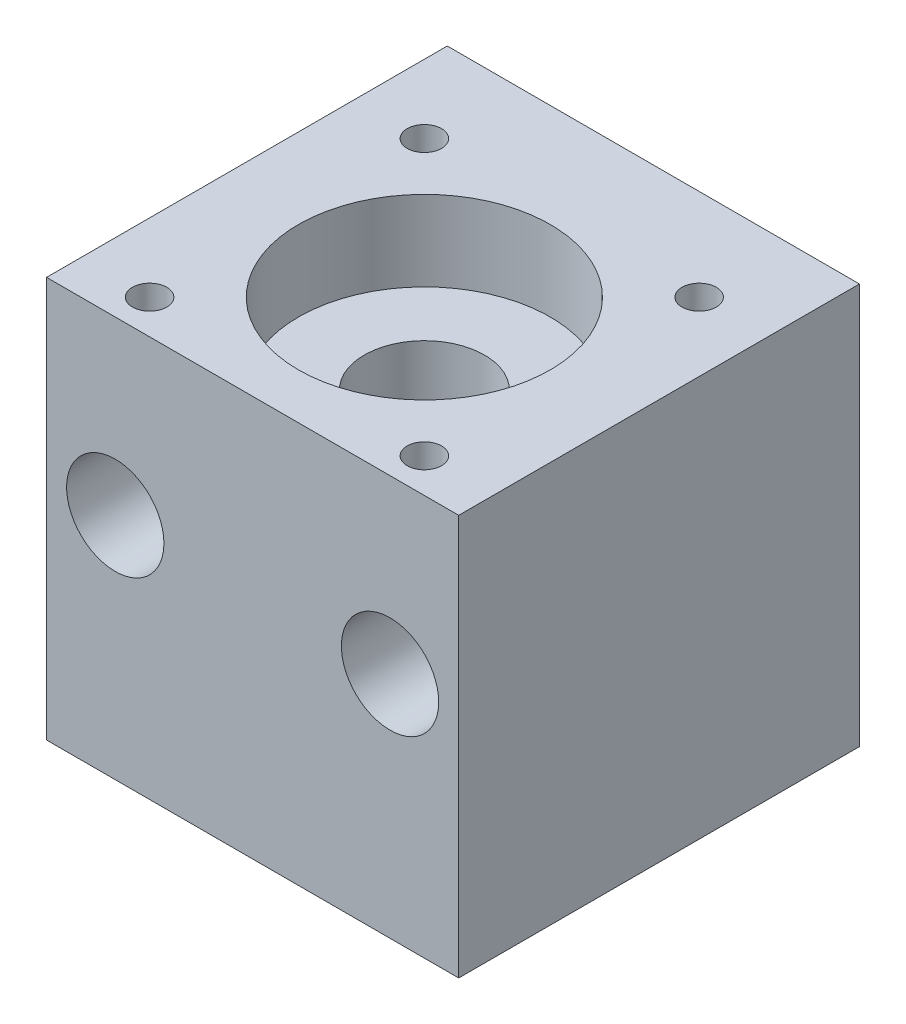
ISO-10303-21;
HEADER;
FILE_DESCRIPTION(('STEP AP214'),'2;1');
FILE_NAME('part.step','',(''),(''),'','','');
FILE_SCHEMA(('AUTOMOTIVE_DESIGN { 1 0 10303 214 1 1 1 1 }'));
ENDSEC;
DATA;
#1=APPLICATION_CONTEXT('core data for automotive mechanical design processes');
#2=APPLICATION_PROTOCOL_DEFINITION('international standard','automotive_design',2000,#1);
#3=PRODUCT_CONTEXT('',#1,'mechanical');
#4=PRODUCT('Part','Part','',(#3));
#5=PRODUCT_RELATED_PRODUCT_CATEGORY('part','',(#4));
#6=PRODUCT_DEFINITION_FORMATION('','',#4);
#7=PRODUCT_DEFINITION_CONTEXT('part definition',#1,'design');
#8=PRODUCT_DEFINITION('design','',#6,#7);
#9=PRODUCT_DEFINITION_SHAPE('','',#8);
#10=(LENGTH_UNIT() NAMED_UNIT(*) SI_UNIT(.MILLI.,.METRE.));
#11=(NAMED_UNIT(*) PLANE_ANGLE_UNIT() SI_UNIT($,.RADIAN.));
#12=(NAMED_UNIT(*) SI_UNIT($,.STERADIAN.) SOLID_ANGLE_UNIT());
#13=UNCERTAINTY_MEASURE_WITH_UNIT(LENGTH_MEASURE(1.E-05),#10,'distance_accuracy_value','');
#14=(GEOMETRIC_REPRESENTATION_CONTEXT(3) GLOBAL_UNCERTAINTY_ASSIGNED_CONTEXT((#13)) GLOBAL_UNIT_ASSIGNED_CONTEXT((#10,
#11,#12)) REPRESENTATION_CONTEXT('',''));
#15=CARTESIAN_POINT('',(0.,0.,0.));
#16=DIRECTION('',(0.,0.,1.));
#17=DIRECTION('',(1.,0.,0.));
#18=AXIS2_PLACEMENT_3D('',#15,#16,#17);
#19=CARTESIAN_POINT('',(18.,0.0077,20.0019));
#20=DIRECTION('',(0.,1.,0.));
#21=DIRECTION('',(0.,0.,1.));
#22=AXIS2_PLACEMENT_3D('',#19,#20,#21);
#23=CYLINDRICAL_SURFACE('',#22,5.25);
#24=CARTESIAN_POINT('',(18.,28.0077,20.0019));
#25=DIRECTION('',(0.,1.,0.));
#26=DIRECTION('',(0.,0.,1.));
#27=AXIS2_PLACEMENT_3D('',#24,#25,#26);
#28=CIRCLE('',#27,5.25);
#29=CARTESIAN_POINT('',(18.,28.0077,25.2519));
#30=VERTEX_POINT('',#29);
#31=EDGE_CURVE('E163',#30,#30,#28,.F.);
#32=ORIENTED_EDGE('',*,*,#31,.F.);
#33=EDGE_LOOP('',(#32));
#34=FACE_BOUND('',#33,.T.);
#35=CARTESIAN_POINT('',(18.,7.0077,20.0019));
#36=DIRECTION('',(0.,1.,0.));
#37=DIRECTION('',(0.,0.,1.));
#38=AXIS2_PLACEMENT_3D('',#35,#36,#37);
#39=CIRCLE('',#38,5.25);
#40=CARTESIAN_POINT('',(18.,7.0077,25.2519));
#41=VERTEX_POINT('',#40);
#42=EDGE_CURVE('E18',#41,#41,#39,.F.);
#43=ORIENTED_EDGE('',*,*,#42,.T.);
#44=EDGE_LOOP('',(#43));
#45=FACE_BOUND('',#44,.T.);
#46=ADVANCED_FACE('F15',(#34,#45),#23,.F.);
#47=CARTESIAN_POINT('',(6.,8.0077,8.0019));
#48=DIRECTION('',(0.,1.,0.));
#49=DIRECTION('',(0.,0.,1.));
#50=AXIS2_PLACEMENT_3D('',#47,#48,#49);
#51=PLANE('',#50);
#52=CARTESIAN_POINT('',(6.,8.0077,8.0019));
#53=DIRECTION('',(0.,1.,0.));
#54=DIRECTION('',(0.,0.,1.));
#55=AXIS2_PLACEMENT_3D('',#52,#53,#54);
#56=CIRCLE('',#55,1.5);
#57=CARTESIAN_POINT('',(6.,8.0077,9.5019));
#58=VERTEX_POINT('',#57);
#59=EDGE_CURVE('E161',#58,#58,#56,.F.);
#60=ORIENTED_EDGE('',*,*,#59,.T.);
#61=EDGE_LOOP('',(#60));
#62=FACE_BOUND('',#61,.T.);
#63=ADVANCED_FACE('F314',(#62),#51,.F.);
#64=CARTESIAN_POINT('',(6.,8.0077,32.0019));
#65=DIRECTION('',(0.,1.,0.));
#66=DIRECTION('',(0.,0.,1.));
#67=AXIS2_PLACEMENT_3D('',#64,#65,#66);
#68=PLANE('',#67);
#69=CARTESIAN_POINT('',(6.,8.0077,32.0019));
#70=DIRECTION('',(0.,1.,0.));
#71=DIRECTION('',(0.,0.,1.));
#72=AXIS2_PLACEMENT_3D('',#69,#70,#71);
#73=CIRCLE('',#72,1.5);
#74=CARTESIAN_POINT('',(6.,8.0077,33.5019));
#75=VERTEX_POINT('',#74);
#76=EDGE_CURVE('E158',#75,#75,#73,.F.);
#77=ORIENTED_EDGE('',*,*,#76,.T.);
#78=EDGE_LOOP('',(#77));
#79=FACE_BOUND('',#78,.T.);
#80=ADVANCED_FACE('F311',(#79),#68,.F.);
#81=CARTESIAN_POINT('',(30.,8.0077,8.0019));
#82=DIRECTION('',(0.,1.,0.));
#83=DIRECTION('',(0.,0.,1.));
#84=AXIS2_PLACEMENT_3D('',#81,#82,#83);
#85=PLANE('',#84);
#86=CARTESIAN_POINT('',(30.,8.0077,8.0019));
#87=DIRECTION('',(0.,1.,0.));
#88=DIRECTION('',(0.,0.,1.));
#89=AXIS2_PLACEMENT_3D('',#86,#87,#88);
#90=CIRCLE('',#89,1.5);
#91=CARTESIAN_POINT('',(30.,8.0077,9.5019));
#92=VERTEX_POINT('',#91);
#93=EDGE_CURVE('E155',#92,#92,#90,.F.);
#94=ORIENTED_EDGE('',*,*,#93,.T.);
#95=EDGE_LOOP('',(#94));
#96=FACE_BOUND('',#95,.T.);
#97=ADVANCED_FACE('F175',(#96),#85,.F.);
#98=CARTESIAN_POINT('',(18.,7.0077,20.0019));
#99=DIRECTION('',(0.,1.,0.));
#100=DIRECTION('',(0.,0.,1.));
#101=AXIS2_PLACEMENT_3D('',#98,#99,#100);
#102=PLANE('',#101);
#103=ORIENTED_EDGE('',*,*,#42,.F.);
#104=EDGE_LOOP('',(#103));
#105=FACE_BOUND('',#104,.T.);
#106=CARTESIAN_POINT('',(18.,7.0077,20.0019));
#107=DIRECTION('',(0.,1.,0.));
#108=DIRECTION('',(0.,0.,1.));
#109=AXIS2_PLACEMENT_3D('',#106,#107,#108);
#110=CIRCLE('',#109,11.);
#111=CARTESIAN_POINT('',(18.,7.0077,31.0019));
#112=VERTEX_POINT('',#111);
#113=EDGE_CURVE('E152',#112,#112,#110,.F.);
#114=ORIENTED_EDGE('',*,*,#113,.T.);
#115=EDGE_LOOP('',(#114));
#116=FACE_BOUND('',#115,.T.);
#117=ADVANCED_FACE('F171',(#105,#116),#102,.F.);
#118=CARTESIAN_POINT('',(30.,8.0077,32.0019));
#119=DIRECTION('',(0.,1.,0.));
#120=DIRECTION('',(0.,0.,1.));
#121=AXIS2_PLACEMENT_3D('',#118,#119,#120);
#122=PLANE('',#121);
#123=CARTESIAN_POINT('',(30.,8.0077,32.0019));
#124=DIRECTION('',(0.,1.,0.));
#125=DIRECTION('',(0.,0.,1.));
#126=AXIS2_PLACEMENT_3D('',#123,#124,#125);
#127=CIRCLE('',#126,1.5);
#128=CARTESIAN_POINT('',(30.,8.0077,33.5019));
#129=VERTEX_POINT('',#128);
#130=EDGE_CURVE('E149',#129,#129,#127,.F.);
#131=ORIENTED_EDGE('',*,*,#130,.T.);
#132=EDGE_LOOP('',(#131));
#133=FACE_BOUND('',#132,.T.);
#134=ADVANCED_FACE('F174',(#133),#122,.F.);
#135=CARTESIAN_POINT('',(6.,27.0077,8.0019));
#136=DIRECTION('',(0.,-1.,0.));
#137=DIRECTION('',(0.,0.,-1.));
#138=AXIS2_PLACEMENT_3D('',#135,#136,#137);
#139=PLANE('',#138);
#140=CARTESIAN_POINT('',(6.,27.0077,8.0019));
#141=DIRECTION('',(0.,-1.,0.));
#142=DIRECTION('',(0.,0.,-1.));
#143=AXIS2_PLACEMENT_3D('',#140,#141,#142);
#144=CIRCLE('',#143,1.5);
#145=CARTESIAN_POINT('',(6.,27.0077,6.5019));
#146=VERTEX_POINT('',#145);
#147=EDGE_CURVE('E140',#146,#146,#144,.F.);
#148=ORIENTED_EDGE('',*,*,#147,.T.);
#149=EDGE_LOOP('',(#148));
#150=FACE_BOUND('',#149,.T.);
#151=ADVANCED_FACE('F301',(#150),#139,.F.);
#152=CARTESIAN_POINT('',(6.,27.0077,32.0019));
#153=DIRECTION('',(0.,-1.,0.));
#154=DIRECTION('',(0.,0.,-1.));
#155=AXIS2_PLACEMENT_3D('',#152,#153,#154);
#156=PLANE('',#155);
#157=CARTESIAN_POINT('',(6.,27.0077,32.0019));
#158=DIRECTION('',(0.,-1.,0.));
#159=DIRECTION('',(0.,0.,-1.));
#160=AXIS2_PLACEMENT_3D('',#157,#158,#159);
#161=CIRCLE('',#160,1.5);
#162=CARTESIAN_POINT('',(6.,27.0077,30.5019));
#163=VERTEX_POINT('',#162);
#164=EDGE_CURVE('E137',#163,#163,#161,.F.);
#165=ORIENTED_EDGE('',*,*,#164,.T.);
#166=EDGE_LOOP('',(#165));
#167=FACE_BOUND('',#166,.T.);
#168=ADVANCED_FACE('F297',(#167),#156,.F.);
#169=CARTESIAN_POINT('',(30.,27.0077,8.0019));
#170=DIRECTION('',(0.,-1.,0.));
#171=DIRECTION('',(0.,0.,-1.));
#172=AXIS2_PLACEMENT_3D('',#169,#170,#171);
#173=PLANE('',#172);
#174=CARTESIAN_POINT('',(30.,27.0077,8.0019));
#175=DIRECTION('',(0.,-1.,0.));
#176=DIRECTION('',(0.,0.,-1.));
#177=AXIS2_PLACEMENT_3D('',#174,#175,#176);
#178=CIRCLE('',#177,1.5);
#179=CARTESIAN_POINT('',(30.,27.0077,6.5019));
#180=VERTEX_POINT('',#179);
#181=EDGE_CURVE('E134',#180,#180,#178,.F.);
#182=ORIENTED_EDGE('',*,*,#181,.T.);
#183=EDGE_LOOP('',(#182));
#184=FACE_BOUND('',#183,.T.);
#185=ADVANCED_FACE('F294',(#184),#173,.F.);
#186=CARTESIAN_POINT('',(18.,28.0077,20.0019));
#187=DIRECTION('',(0.,1.,0.));
#188=DIRECTION('',(0.,0.,1.));
#189=AXIS2_PLACEMENT_3D('',#186,#187,#188);
#190=PLANE('',#189);
#191=ORIENTED_EDGE('',*,*,#31,.T.);
#192=EDGE_LOOP('',(#191));
#193=FACE_BOUND('',#192,.T.);
#194=CARTESIAN_POINT('',(18.,28.0077,20.0019));
#195=DIRECTION('',(0.,1.,0.));
#196=DIRECTION('',(0.,0.,1.));
#197=AXIS2_PLACEMENT_3D('',#194,#195,#196);
#198=CIRCLE('',#197,11.);
#199=CARTESIAN_POINT('',(18.,28.0077,31.0019));
#200=VERTEX_POINT('',#199);
#201=EDGE_CURVE('E131',#200,#200,#198,.T.);
#202=ORIENTED_EDGE('',*,*,#201,.T.);
#203=EDGE_LOOP('',(#202));
#204=FACE_BOUND('',#203,.T.);
#205=ADVANCED_FACE('F287',(#193,#204),#190,.T.);
#206=CARTESIAN_POINT('',(30.,27.0077,32.0019));
#207=DIRECTION('',(0.,-1.,0.));
#208=DIRECTION('',(0.,0.,-1.));
#209=AXIS2_PLACEMENT_3D('',#206,#207,#208);
#210=PLANE('',#209);
#211=CARTESIAN_POINT('',(30.,27.0077,32.0019));
#212=DIRECTION('',(0.,-1.,0.));
#213=DIRECTION('',(0.,0.,-1.));
#214=AXIS2_PLACEMENT_3D('',#211,#212,#213);
#215=CIRCLE('',#214,1.5);
#216=CARTESIAN_POINT('',(30.,27.0077,30.5019));
#217=VERTEX_POINT('',#216);
#218=EDGE_CURVE('E128',#217,#217,#215,.F.);
#219=ORIENTED_EDGE('',*,*,#218,.T.);
#220=EDGE_LOOP('',(#219));
#221=FACE_BOUND('',#220,.T.);
#222=ADVANCED_FACE('F264',(#221),#210,.F.);
#223=CARTESIAN_POINT('',(6.,20.0077,27.0019));
#224=DIRECTION('',(0.,0.,1.));
#225=DIRECTION('',(1.,0.,0.));
#226=AXIS2_PLACEMENT_3D('',#223,#224,#225);
#227=PLANE('',#226);
#228=CARTESIAN_POINT('',(6.,20.0077,27.0019));
#229=DIRECTION('',(0.,0.,1.));
#230=DIRECTION('',(1.,0.,0.));
#231=AXIS2_PLACEMENT_3D('',#228,#229,#230);
#232=CIRCLE('',#231,2.75);
#233=CARTESIAN_POINT('',(8.75,20.0077,27.0019));
#234=VERTEX_POINT('',#233);
#235=EDGE_CURVE('E146',#234,#234,#232,.F.);
#236=ORIENTED_EDGE('',*,*,#235,.T.);
#237=EDGE_LOOP('',(#236));
#238=FACE_BOUND('',#237,.T.);
#239=CARTESIAN_POINT('',(6.,20.0077,27.0019));
#240=DIRECTION('',(0.,0.,1.));
#241=DIRECTION('',(1.,0.,0.));
#242=AXIS2_PLACEMENT_3D('',#239,#240,#241);
#243=CIRCLE('',#242,4.25);
#244=CARTESIAN_POINT('',(10.25,20.0077,27.0019));
#245=VERTEX_POINT('',#244);
#246=EDGE_CURVE('E125',#245,#245,#243,.T.);
#247=ORIENTED_EDGE('',*,*,#246,.T.);
#248=EDGE_LOOP('',(#247));
#249=FACE_BOUND('',#248,.T.);
#250=ADVANCED_FACE('F260',(#238,#249),#227,.T.);
#251=CARTESIAN_POINT('',(30.,20.0077,27.0019));
#252=DIRECTION('',(0.,0.,1.));
#253=DIRECTION('',(1.,0.,0.));
#254=AXIS2_PLACEMENT_3D('',#251,#252,#253);
#255=PLANE('',#254);
#256=CARTESIAN_POINT('',(30.,20.0077,27.0019));
#257=DIRECTION('',(0.,0.,1.));
#258=DIRECTION('',(1.,0.,0.));
#259=AXIS2_PLACEMENT_3D('',#256,#257,#258);
#260=CIRCLE('',#259,2.75);
#261=CARTESIAN_POINT('',(32.75,20.0077,27.0019));
#262=VERTEX_POINT('',#261);
#263=EDGE_CURVE('E143',#262,#262,#260,.F.);
#264=ORIENTED_EDGE('',*,*,#263,.T.);
#265=EDGE_LOOP('',(#264));
#266=FACE_BOUND('',#265,.T.);
#267=CARTESIAN_POINT('',(30.,20.0077,27.0019));
#268=DIRECTION('',(0.,0.,1.));
#269=DIRECTION('',(1.,0.,0.));
#270=AXIS2_PLACEMENT_3D('',#267,#268,#269);
#271=CIRCLE('',#270,4.25);
#272=CARTESIAN_POINT('',(34.25,20.0077,27.0019));
#273=VERTEX_POINT('',#272);
#274=EDGE_CURVE('E64',#273,#273,#271,.T.);
#275=ORIENTED_EDGE('',*,*,#274,.T.);
#276=EDGE_LOOP('',(#275));
#277=FACE_BOUND('',#276,.T.);
#278=ADVANCED_FACE('F263',(#266,#277),#255,.T.);
#279=CARTESIAN_POINT('',(6.,0.0077,8.0019));
#280=DIRECTION('',(0.,1.,0.));
#281=DIRECTION('',(0.,0.,1.));
#282=AXIS2_PLACEMENT_3D('',#279,#280,#281);
#283=CYLINDRICAL_SURFACE('',#282,1.5);
#284=CARTESIAN_POINT('',(6.,0.0077,8.0019));
#285=DIRECTION('',(0.,1.,0.));
#286=DIRECTION('',(0.,0.,1.));
#287=AXIS2_PLACEMENT_3D('',#284,#285,#286);
#288=CIRCLE('',#287,1.5);
#289=CARTESIAN_POINT('',(6.,0.0077,9.5019));
#290=VERTEX_POINT('',#289);
#291=EDGE_CURVE('E63',#290,#290,#288,.F.);
#292=ORIENTED_EDGE('',*,*,#291,.T.);
#293=EDGE_LOOP('',(#292));
#294=FACE_BOUND('',#293,.T.);
#295=ORIENTED_EDGE('',*,*,#59,.F.);
#296=EDGE_LOOP('',(#295));
#297=FACE_BOUND('',#296,.T.);
#298=ADVANCED_FACE('F284',(#294,#297),#283,.F.);
#299=CARTESIAN_POINT('',(6.,0.0077,32.0019));
#300=DIRECTION('',(0.,1.,0.));
#301=DIRECTION('',(0.,0.,1.));
#302=AXIS2_PLACEMENT_3D('',#299,#300,#301);
#303=CYLINDRICAL_SURFACE('',#302,1.5);
#304=CARTESIAN_POINT('',(6.,0.0077,32.0019));
#305=DIRECTION('',(0.,1.,0.));
#306=DIRECTION('',(0.,0.,1.));
#307=AXIS2_PLACEMENT_3D('',#304,#305,#306);
#308=CIRCLE('',#307,1.5);
#309=CARTESIAN_POINT('',(6.,0.0077,33.5019));
#310=VERTEX_POINT('',#309);
#311=EDGE_CURVE('E118',#310,#310,#308,.F.);
#312=ORIENTED_EDGE('',*,*,#311,.T.);
#313=EDGE_LOOP('',(#312));
#314=FACE_BOUND('',#313,.T.);
#315=ORIENTED_EDGE('',*,*,#76,.F.);
#316=EDGE_LOOP('',(#315));
#317=FACE_BOUND('',#316,.T.);
#318=ADVANCED_FACE('F193',(#314,#317),#303,.F.);
#319=CARTESIAN_POINT('',(30.,0.0077,8.0019));
#320=DIRECTION('',(0.,1.,0.));
#321=DIRECTION('',(0.,0.,1.));
#322=AXIS2_PLACEMENT_3D('',#319,#320,#321);
#323=CYLINDRICAL_SURFACE('',#322,1.5);
#324=CARTESIAN_POINT('',(30.,0.0077,8.0019));
#325=DIRECTION('',(0.,1.,0.));
#326=DIRECTION('',(0.,0.,1.));
#327=AXIS2_PLACEMENT_3D('',#324,#325,#326);
#328=CIRCLE('',#327,1.5);
#329=CARTESIAN_POINT('',(30.,0.0077,9.5019));
#330=VERTEX_POINT('',#329);
#331=EDGE_CURVE('E115',#330,#330,#328,.F.);
#332=ORIENTED_EDGE('',*,*,#331,.T.);
#333=EDGE_LOOP('',(#332));
#334=FACE_BOUND('',#333,.T.);
#335=ORIENTED_EDGE('',*,*,#93,.F.);
#336=EDGE_LOOP('',(#335));
#337=FACE_BOUND('',#336,.T.);
#338=ADVANCED_FACE('F182',(#334,#337),#323,.F.);
#339=CARTESIAN_POINT('',(18.,0.0077,20.0019));
#340=DIRECTION('',(0.,1.,0.));
#341=DIRECTION('',(0.,0.,1.));
#342=AXIS2_PLACEMENT_3D('',#339,#340,#341);
#343=CYLINDRICAL_SURFACE('',#342,11.);
#344=CARTESIAN_POINT('',(18.,0.0077,20.0019));
#345=DIRECTION('',(0.,1.,0.));
#346=DIRECTION('',(0.,0.,1.));
#347=AXIS2_PLACEMENT_3D('',#344,#345,#346);
#348=CIRCLE('',#347,11.);
#349=CARTESIAN_POINT('',(18.,0.0077,31.0019));
#350=VERTEX_POINT('',#349);
#351=EDGE_CURVE('E81',#350,#350,#348,.F.);
#352=ORIENTED_EDGE('',*,*,#351,.T.);
#353=EDGE_LOOP('',(#352));
#354=FACE_BOUND('',#353,.T.);
#355=ORIENTED_EDGE('',*,*,#113,.F.);
#356=EDGE_LOOP('',(#355));
#357=FACE_BOUND('',#356,.T.);
#358=ADVANCED_FACE('F179',(#354,#357),#343,.F.);
#359=CARTESIAN_POINT('',(30.,0.0077,32.0019));
#360=DIRECTION('',(0.,1.,0.));
#361=DIRECTION('',(0.,0.,1.));
#362=AXIS2_PLACEMENT_3D('',#359,#360,#361);
#363=CYLINDRICAL_SURFACE('',#362,1.5);
#364=CARTESIAN_POINT('',(30.,0.0077,32.0019));
#365=DIRECTION('',(0.,1.,0.));
#366=DIRECTION('',(0.,0.,1.));
#367=AXIS2_PLACEMENT_3D('',#364,#365,#366);
#368=CIRCLE('',#367,1.5);
#369=CARTESIAN_POINT('',(30.,0.0077,33.5019));
#370=VERTEX_POINT('',#369);
#371=EDGE_CURVE('E78',#370,#370,#368,.F.);
#372=ORIENTED_EDGE('',*,*,#371,.T.);
#373=EDGE_LOOP('',(#372));
#374=FACE_BOUND('',#373,.T.);
#375=ORIENTED_EDGE('',*,*,#130,.F.);
#376=EDGE_LOOP('',(#375));
#377=FACE_BOUND('',#376,.T.);
#378=ADVANCED_FACE('F181',(#374,#377),#363,.F.);
#379=CARTESIAN_POINT('',(6.,20.0077,0.001899999999978));
#380=DIRECTION('',(0.,0.,1.));
#381=DIRECTION('',(1.,0.,0.));
#382=AXIS2_PLACEMENT_3D('',#379,#380,#381);
#383=CYLINDRICAL_SURFACE('',#382,2.75);
#384=CARTESIAN_POINT('',(6.,20.0077,0.001899999999978));
#385=DIRECTION('',(0.,0.,1.));
#386=DIRECTION('',(1.,0.,0.));
#387=AXIS2_PLACEMENT_3D('',#384,#385,#386);
#388=CIRCLE('',#387,2.75);
#389=CARTESIAN_POINT('',(8.75,20.0077,0.001899999999978));
#390=VERTEX_POINT('',#389);
#391=EDGE_CURVE('E73',#390,#390,#388,.F.);
#392=ORIENTED_EDGE('',*,*,#391,.T.);
#393=EDGE_LOOP('',(#392));
#394=FACE_BOUND('',#393,.T.);
#395=ORIENTED_EDGE('',*,*,#235,.F.);
#396=EDGE_LOOP('',(#395));
#397=FACE_BOUND('',#396,.T.);
#398=ADVANCED_FACE('F190',(#394,#397),#383,.F.);
#399=CARTESIAN_POINT('',(30.,20.0077,0.001899999999978));
#400=DIRECTION('',(0.,0.,1.));
#401=DIRECTION('',(1.,0.,0.));
#402=AXIS2_PLACEMENT_3D('',#399,#400,#401);
#403=CYLINDRICAL_SURFACE('',#402,2.75);
#404=CARTESIAN_POINT('',(30.,20.0077,0.001899999999978));
#405=DIRECTION('',(0.,0.,1.));
#406=DIRECTION('',(1.,0.,0.));
#407=AXIS2_PLACEMENT_3D('',#404,#405,#406);
#408=CIRCLE('',#407,2.75);
#409=CARTESIAN_POINT('',(32.75,20.0077,0.001899999999978));
#410=VERTEX_POINT('',#409);
#411=EDGE_CURVE('E108',#410,#410,#408,.F.);
#412=ORIENTED_EDGE('',*,*,#411,.T.);
#413=EDGE_LOOP('',(#412));
#414=FACE_BOUND('',#413,.T.);
#415=ORIENTED_EDGE('',*,*,#263,.F.);
#416=EDGE_LOOP('',(#415));
#417=FACE_BOUND('',#416,.T.);
#418=ADVANCED_FACE('F247',(#414,#417),#403,.F.);
#419=CARTESIAN_POINT('',(6.,35.0077,8.0019));
#420=DIRECTION('',(0.,-1.,0.));
#421=DIRECTION('',(0.,0.,-1.));
#422=AXIS2_PLACEMENT_3D('',#419,#420,#421);
#423=CYLINDRICAL_SURFACE('',#422,1.5);
#424=CARTESIAN_POINT('',(6.,35.0077,8.0019));
#425=DIRECTION('',(0.,-1.,0.));
#426=DIRECTION('',(0.,0.,-1.));
#427=AXIS2_PLACEMENT_3D('',#424,#425,#426);
#428=CIRCLE('',#427,1.5);
#429=CARTESIAN_POINT('',(6.,35.0077,6.5019));
#430=VERTEX_POINT('',#429);
#431=EDGE_CURVE('E104',#430,#430,#428,.T.);
#432=ORIENTED_EDGE('',*,*,#431,.F.);
#433=EDGE_LOOP('',(#432));
#434=FACE_BOUND('',#433,.T.);
#435=ORIENTED_EDGE('',*,*,#147,.F.);
#436=EDGE_LOOP('',(#435));
#437=FACE_BOUND('',#436,.T.);
#438=ADVANCED_FACE('F243',(#434,#437),#423,.F.);
#439=CARTESIAN_POINT('',(6.,35.0077,32.0019));
#440=DIRECTION('',(0.,-1.,0.));
#441=DIRECTION('',(0.,0.,-1.));
#442=AXIS2_PLACEMENT_3D('',#439,#440,#441);
#443=CYLINDRICAL_SURFACE('',#442,1.5);
#444=CARTESIAN_POINT('',(6.,35.0077,32.0019));
#445=DIRECTION('',(0.,-1.,0.));
#446=DIRECTION('',(0.,0.,-1.));
#447=AXIS2_PLACEMENT_3D('',#444,#445,#446);
#448=CIRCLE('',#447,1.5);
#449=CARTESIAN_POINT('',(6.,35.0077,30.5019));
#450=VERTEX_POINT('',#449);
#451=EDGE_CURVE('E101',#450,#450,#448,.T.);
#452=ORIENTED_EDGE('',*,*,#451,.F.);
#453=EDGE_LOOP('',(#452));
#454=FACE_BOUND('',#453,.T.);
#455=ORIENTED_EDGE('',*,*,#164,.F.);
#456=EDGE_LOOP('',(#455));
#457=FACE_BOUND('',#456,.T.);
#458=ADVANCED_FACE('F239',(#454,#457),#443,.F.);
#459=CARTESIAN_POINT('',(30.,35.0077,8.0019));
#460=DIRECTION('',(0.,-1.,0.));
#461=DIRECTION('',(0.,0.,-1.));
#462=AXIS2_PLACEMENT_3D('',#459,#460,#461);
#463=CYLINDRICAL_SURFACE('',#462,1.5);
#464=CARTESIAN_POINT('',(30.,35.0077,8.0019));
#465=DIRECTION('',(0.,-1.,0.));
#466=DIRECTION('',(0.,0.,-1.));
#467=AXIS2_PLACEMENT_3D('',#464,#465,#466);
#468=CIRCLE('',#467,1.5);
#469=CARTESIAN_POINT('',(30.,35.0077,6.5019));
#470=VERTEX_POINT('',#469);
#471=EDGE_CURVE('E98',#470,#470,#468,.T.);
#472=ORIENTED_EDGE('',*,*,#471,.F.);
#473=EDGE_LOOP('',(#472));
#474=FACE_BOUND('',#473,.T.);
#475=ORIENTED_EDGE('',*,*,#181,.F.);
#476=EDGE_LOOP('',(#475));
#477=FACE_BOUND('',#476,.T.);
#478=ADVANCED_FACE('F235',(#474,#477),#463,.F.);
#479=CARTESIAN_POINT('',(18.,28.0077,20.0019));
#480=DIRECTION('',(0.,1.,0.));
#481=DIRECTION('',(0.,0.,1.));
#482=AXIS2_PLACEMENT_3D('',#479,#480,#481);
#483=CYLINDRICAL_SURFACE('',#482,11.);
#484=ORIENTED_EDGE('',*,*,#201,.F.);
#485=EDGE_LOOP('',(#484));
#486=FACE_BOUND('',#485,.T.);
#487=CARTESIAN_POINT('',(18.,35.0077,20.0019));
#488=DIRECTION('',(0.,1.,0.));
#489=DIRECTION('',(0.,0.,1.));
#490=AXIS2_PLACEMENT_3D('',#487,#488,#489);
#491=CIRCLE('',#490,11.);
#492=CARTESIAN_POINT('',(18.,35.0077,31.0019));
#493=VERTEX_POINT('',#492);
#494=EDGE_CURVE('E95',#493,#493,#491,.F.);
#495=ORIENTED_EDGE('',*,*,#494,.F.);
#496=EDGE_LOOP('',(#495));
#497=FACE_BOUND('',#496,.T.);
#498=ADVANCED_FACE('F231',(#486,#497),#483,.F.);
#499=CARTESIAN_POINT('',(30.,35.0077,32.0019));
#500=DIRECTION('',(0.,-1.,0.));
#501=DIRECTION('',(0.,0.,-1.));
#502=AXIS2_PLACEMENT_3D('',#499,#500,#501);
#503=CYLINDRICAL_SURFACE('',#502,1.5);
#504=CARTESIAN_POINT('',(30.,35.0077,32.0019));
#505=DIRECTION('',(0.,-1.,0.));
#506=DIRECTION('',(0.,0.,-1.));
#507=AXIS2_PLACEMENT_3D('',#504,#505,#506);
#508=CIRCLE('',#507,1.5);
#509=CARTESIAN_POINT('',(30.,35.0077,30.5019));
#510=VERTEX_POINT('',#509);
#511=EDGE_CURVE('E91',#510,#510,#508,.T.);
#512=ORIENTED_EDGE('',*,*,#511,.F.);
#513=EDGE_LOOP('',(#512));
#514=FACE_BOUND('',#513,.T.);
#515=ORIENTED_EDGE('',*,*,#218,.F.);
#516=EDGE_LOOP('',(#515));
#517=FACE_BOUND('',#516,.T.);
#518=ADVANCED_FACE('F228',(#514,#517),#503,.F.);
#519=CARTESIAN_POINT('',(36.,0.0077,0.001899999999978));
#520=DIRECTION('',(1.,0.,0.));
#521=DIRECTION('',(0.,0.,-1.));
#522=AXIS2_PLACEMENT_3D('',#519,#520,#521);
#523=PLANE('',#522);
#524=DIRECTION('',(0.,0.,1.));
#525=VECTOR('',#524,1.);
#526=CARTESIAN_POINT('',(36.,35.0077,0.001899999999978));
#527=LINE('',#526,#525);
#528=CARTESIAN_POINT('',(36.,35.0077,35.0019));
#529=VERTEX_POINT('',#528);
#530=CARTESIAN_POINT('',(36.,35.0077,0.001899999999978));
#531=VERTEX_POINT('',#530);
#532=EDGE_CURVE('E107',#529,#531,#527,.F.);
#533=ORIENTED_EDGE('',*,*,#532,.F.);
#534=DIRECTION('',(0.,1.,0.));
#535=VECTOR('',#534,1.);
#536=CARTESIAN_POINT('',(36.,0.0077,35.0019));
#537=LINE('',#536,#535);
#538=CARTESIAN_POINT('',(36.,0.0077,35.0019));
#539=VERTEX_POINT('',#538);
#540=EDGE_CURVE('E58',#539,#529,#537,.T.);
#541=ORIENTED_EDGE('',*,*,#540,.F.);
#542=DIRECTION('',(0.,0.,1.));
#543=VECTOR('',#542,1.);
#544=CARTESIAN_POINT('',(36.,0.0077,0.001899999999978));
#545=LINE('',#544,#543);
#546=CARTESIAN_POINT('',(36.,0.0077,0.001899999999978));
#547=VERTEX_POINT('',#546);
#548=EDGE_CURVE('E56',#539,#547,#545,.F.);
#549=ORIENTED_EDGE('',*,*,#548,.T.);
#550=DIRECTION('',(0.,1.,0.));
#551=VECTOR('',#550,1.);
#552=CARTESIAN_POINT('',(36.,0.0077,0.001899999999978));
#553=LINE('',#552,#551);
#554=EDGE_CURVE('E53',#547,#531,#553,.T.);
#555=ORIENTED_EDGE('',*,*,#554,.T.);
#556=EDGE_LOOP('',(#533,#541,#549,#555));
#557=FACE_BOUND('',#556,.T.);
#558=ADVANCED_FACE('F57',(#557),#523,.T.);
#559=CARTESIAN_POINT('',(6.,20.0077,27.0019));
#560=DIRECTION('',(0.,0.,1.));
#561=DIRECTION('',(1.,0.,0.));
#562=AXIS2_PLACEMENT_3D('',#559,#560,#561);
#563=CYLINDRICAL_SURFACE('',#562,4.25);
#564=ORIENTED_EDGE('',*,*,#246,.F.);
#565=EDGE_LOOP('',(#564));
#566=FACE_BOUND('',#565,.T.);
#567=CARTESIAN_POINT('',(6.,20.0077,35.0019));
#568=DIRECTION('',(0.,0.,1.));
#569=DIRECTION('',(1.,0.,0.));
#570=AXIS2_PLACEMENT_3D('',#567,#568,#569);
#571=CIRCLE('',#570,4.25);
#572=CARTESIAN_POINT('',(10.25,20.0077,35.0019));
#573=VERTEX_POINT('',#572);
#574=EDGE_CURVE('E88',#573,#573,#571,.F.);
#575=ORIENTED_EDGE('',*,*,#574,.F.);
#576=EDGE_LOOP('',(#575));
#577=FACE_BOUND('',#576,.T.);
#578=ADVANCED_FACE('F221',(#566,#577),#563,.F.);
#579=CARTESIAN_POINT('',(30.,20.0077,27.0019));
#580=DIRECTION('',(0.,0.,1.));
#581=DIRECTION('',(1.,0.,0.));
#582=AXIS2_PLACEMENT_3D('',#579,#580,#581);
#583=CYLINDRICAL_SURFACE('',#582,4.25);
#584=ORIENTED_EDGE('',*,*,#274,.F.);
#585=EDGE_LOOP('',(#584));
#586=FACE_BOUND('',#585,.T.);
#587=CARTESIAN_POINT('',(30.,20.0077,35.0019));
#588=DIRECTION('',(0.,0.,1.));
#589=DIRECTION('',(1.,0.,0.));
#590=AXIS2_PLACEMENT_3D('',#587,#588,#589);
#591=CIRCLE('',#590,4.25);
#592=CARTESIAN_POINT('',(34.25,20.0077,35.0019));
#593=VERTEX_POINT('',#592);
#594=EDGE_CURVE('E85',#593,#593,#591,.F.);
#595=ORIENTED_EDGE('',*,*,#594,.F.);
#596=EDGE_LOOP('',(#595));
#597=FACE_BOUND('',#596,.T.);
#598=ADVANCED_FACE('F217',(#586,#597),#583,.F.);
#599=CARTESIAN_POINT('',(0.,0.0077,0.001899999999978));
#600=DIRECTION('',(0.,1.,0.));
#601=DIRECTION('',(0.,0.,1.));
#602=AXIS2_PLACEMENT_3D('',#599,#600,#601);
#603=PLANE('',#602);
#604=ORIENTED_EDGE('',*,*,#371,.F.);
#605=EDGE_LOOP('',(#604));
#606=FACE_BOUND('',#605,.T.);
#607=ORIENTED_EDGE('',*,*,#351,.F.);
#608=EDGE_LOOP('',(#607));
#609=FACE_BOUND('',#608,.T.);
#610=ORIENTED_EDGE('',*,*,#331,.F.);
#611=EDGE_LOOP('',(#610));
#612=FACE_BOUND('',#611,.T.);
#613=ORIENTED_EDGE('',*,*,#311,.F.);
#614=EDGE_LOOP('',(#613));
#615=FACE_BOUND('',#614,.T.);
#616=ORIENTED_EDGE('',*,*,#291,.F.);
#617=EDGE_LOOP('',(#616));
#618=FACE_BOUND('',#617,.T.);
#619=DIRECTION('',(1.,0.,0.));
#620=VECTOR('',#619,1.);
#621=CARTESIAN_POINT('',(0.,0.0077,35.0019));
#622=LINE('',#621,#620);
#623=CARTESIAN_POINT('',(0.,0.0077,35.0019));
#624=VERTEX_POINT('',#623);
#625=EDGE_CURVE('E94',#624,#539,#622,.T.);
#626=ORIENTED_EDGE('',*,*,#625,.F.);
#627=DIRECTION('',(0.,0.,-1.));
#628=VECTOR('',#627,1.);
#629=CARTESIAN_POINT('',(0.,0.0077,0.001899999999978));
#630=LINE('',#629,#628);
#631=CARTESIAN_POINT('',(0.,0.0077,0.001899999999978));
#632=VERTEX_POINT('',#631);
#633=EDGE_CURVE('E77',#624,#632,#630,.T.);
#634=ORIENTED_EDGE('',*,*,#633,.T.);
#635=DIRECTION('',(1.,0.,0.));
#636=VECTOR('',#635,1.);
#637=CARTESIAN_POINT('',(0.,0.0077,0.001899999999978));
#638=LINE('',#637,#636);
#639=EDGE_CURVE('E70',#632,#547,#638,.T.);
#640=ORIENTED_EDGE('',*,*,#639,.T.);
#641=ORIENTED_EDGE('',*,*,#548,.F.);
#642=EDGE_LOOP('',(#626,#634,#640,#641));
#643=FACE_BOUND('',#642,.T.);
#644=ADVANCED_FACE('F76',(#606,#609,#612,#615,#618,#643),#603,.F.);
#645=CARTESIAN_POINT('',(0.,0.0077,0.001899999999978));
#646=DIRECTION('',(0.,0.,1.));
#647=DIRECTION('',(1.,0.,0.));
#648=AXIS2_PLACEMENT_3D('',#645,#646,#647);
#649=PLANE('',#648);
#650=ORIENTED_EDGE('',*,*,#411,.F.);
#651=EDGE_LOOP('',(#650));
#652=FACE_BOUND('',#651,.T.);
#653=ORIENTED_EDGE('',*,*,#391,.F.);
#654=EDGE_LOOP('',(#653));
#655=FACE_BOUND('',#654,.T.);
#656=ORIENTED_EDGE('',*,*,#554,.F.);
#657=ORIENTED_EDGE('',*,*,#639,.F.);
#658=DIRECTION('',(0.,1.,0.));
#659=VECTOR('',#658,1.);
#660=CARTESIAN_POINT('',(0.,0.0077,0.001899999999978));
#661=LINE('',#660,#659);
#662=CARTESIAN_POINT('',(0.,35.0077,0.001899999999978));
#663=VERTEX_POINT('',#662);
#664=EDGE_CURVE('E278',#632,#663,#661,.T.);
#665=ORIENTED_EDGE('',*,*,#664,.T.);
#666=DIRECTION('',(1.,0.,0.));
#667=VECTOR('',#666,1.);
#668=CARTESIAN_POINT('',(0.,35.0077,0.001899999999978));
#669=LINE('',#668,#667);
#670=EDGE_CURVE('E72',#531,#663,#669,.F.);
#671=ORIENTED_EDGE('',*,*,#670,.F.);
#672=EDGE_LOOP('',(#656,#657,#665,#671));
#673=FACE_BOUND('',#672,.T.);
#674=ADVANCED_FACE('F68',(#652,#655,#673),#649,.F.);
#675=CARTESIAN_POINT('',(0.,35.0077,0.001899999999978));
#676=DIRECTION('',(0.,1.,0.));
#677=DIRECTION('',(0.,0.,1.));
#678=AXIS2_PLACEMENT_3D('',#675,#676,#677);
#679=PLANE('',#678);
#680=ORIENTED_EDGE('',*,*,#511,.T.);
#681=EDGE_LOOP('',(#680));
#682=FACE_BOUND('',#681,.T.);
#683=ORIENTED_EDGE('',*,*,#494,.T.);
#684=EDGE_LOOP('',(#683));
#685=FACE_BOUND('',#684,.T.);
#686=ORIENTED_EDGE('',*,*,#471,.T.);
#687=EDGE_LOOP('',(#686));
#688=FACE_BOUND('',#687,.T.);
#689=ORIENTED_EDGE('',*,*,#451,.T.);
#690=EDGE_LOOP('',(#689));
#691=FACE_BOUND('',#690,.T.);
#692=ORIENTED_EDGE('',*,*,#431,.T.);
#693=EDGE_LOOP('',(#692));
#694=FACE_BOUND('',#693,.T.);
#695=DIRECTION('',(1.,0.,0.));
#696=VECTOR('',#695,1.);
#697=CARTESIAN_POINT('',(0.,35.0077,35.0019));
#698=LINE('',#697,#696);
#699=CARTESIAN_POINT('',(0.,35.0077,35.0019));
#700=VERTEX_POINT('',#699);
#701=EDGE_CURVE('E32',#529,#700,#698,.F.);
#702=ORIENTED_EDGE('',*,*,#701,.F.);
#703=ORIENTED_EDGE('',*,*,#532,.T.);
#704=ORIENTED_EDGE('',*,*,#670,.T.);
#705=DIRECTION('',(0.,0.,-1.));
#706=VECTOR('',#705,1.);
#707=CARTESIAN_POINT('',(0.,35.0077,0.001899999999978));
#708=LINE('',#707,#706);
#709=EDGE_CURVE('E24',#663,#700,#708,.F.);
#710=ORIENTED_EDGE('',*,*,#709,.T.);
#711=EDGE_LOOP('',(#702,#703,#704,#710));
#712=FACE_BOUND('',#711,.T.);
#713=ADVANCED_FACE('F204',(#682,#685,#688,#691,#694,#712),#679,.T.);
#714=CARTESIAN_POINT('',(0.,0.0077,35.0019));
#715=DIRECTION('',(0.,0.,1.));
#716=DIRECTION('',(1.,0.,0.));
#717=AXIS2_PLACEMENT_3D('',#714,#715,#716);
#718=PLANE('',#717);
#719=ORIENTED_EDGE('',*,*,#594,.T.);
#720=EDGE_LOOP('',(#719));
#721=FACE_BOUND('',#720,.T.);
#722=ORIENTED_EDGE('',*,*,#574,.T.);
#723=EDGE_LOOP('',(#722));
#724=FACE_BOUND('',#723,.T.);
#725=ORIENTED_EDGE('',*,*,#540,.T.);
#726=ORIENTED_EDGE('',*,*,#701,.T.);
#727=DIRECTION('',(0.,1.,0.));
#728=VECTOR('',#727,1.);
#729=CARTESIAN_POINT('',(0.,0.0077,35.0019));
#730=LINE('',#729,#728);
#731=EDGE_CURVE('E9',#700,#624,#730,.F.);
#732=ORIENTED_EDGE('',*,*,#731,.T.);
#733=ORIENTED_EDGE('',*,*,#625,.T.);
#734=EDGE_LOOP('',(#725,#726,#732,#733));
#735=FACE_BOUND('',#734,.T.);
#736=ADVANCED_FACE('F198',(#721,#724,#735),#718,.T.);
#737=CARTESIAN_POINT('',(0.,0.0077,0.001899999999978));
#738=DIRECTION('',(1.,0.,0.));
#739=DIRECTION('',(0.,0.,-1.));
#740=AXIS2_PLACEMENT_3D('',#737,#738,#739);
#741=PLANE('',#740);
#742=ORIENTED_EDGE('',*,*,#709,.F.);
#743=ORIENTED_EDGE('',*,*,#664,.F.);
#744=ORIENTED_EDGE('',*,*,#633,.F.);
#745=ORIENTED_EDGE('',*,*,#731,.F.);
#746=EDGE_LOOP('',(#742,#743,#744,#745));
#747=FACE_BOUND('',#746,.T.);
#748=ADVANCED_FACE('F196',(#747),#741,.F.);
#749=CLOSED_SHELL('',(#46,#63,#80,#97,#117,#134,#151,#168,#185,#205,#222,#250,#278,#298,#318,
#338,#358,#378,#398,#418,#438,#458,#478,#498,#518,#558,#578,#598,#644,#674,#713,#736,#748));
#750=MANIFOLD_SOLID_BREP('B1',#749);
#751=ADVANCED_BREP_SHAPE_REPRESENTATION('',(#18,#750),#14);
#752=SHAPE_DEFINITION_REPRESENTATION(#9,#751);
ENDSEC;
END-ISO-10303-21;
